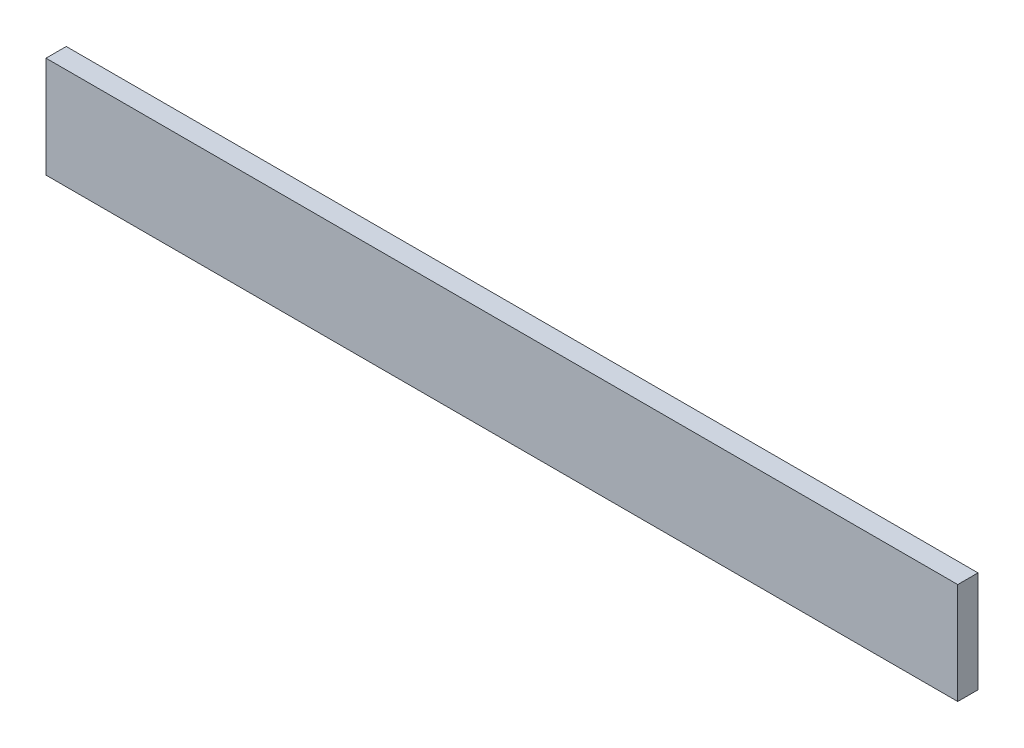
ISO-10303-21;
HEADER;
FILE_DESCRIPTION(('STEP AP214'),'2;1');
FILE_NAME('part.step','',(''),(''),'','','');
FILE_SCHEMA(('AUTOMOTIVE_DESIGN { 1 0 10303 214 1 1 1 1 }'));
ENDSEC;
DATA;
#1=APPLICATION_CONTEXT('core data for automotive mechanical design processes');
#2=APPLICATION_PROTOCOL_DEFINITION('international standard','automotive_design',2000,#1);
#3=PRODUCT_CONTEXT('',#1,'mechanical');
#4=PRODUCT('Part','Part','',(#3));
#5=PRODUCT_RELATED_PRODUCT_CATEGORY('part','',(#4));
#6=PRODUCT_DEFINITION_FORMATION('','',#4);
#7=PRODUCT_DEFINITION_CONTEXT('part definition',#1,'design');
#8=PRODUCT_DEFINITION('design','',#6,#7);
#9=PRODUCT_DEFINITION_SHAPE('','',#8);
#10=(LENGTH_UNIT() NAMED_UNIT(*) SI_UNIT(.MILLI.,.METRE.));
#11=(NAMED_UNIT(*) PLANE_ANGLE_UNIT() SI_UNIT($,.RADIAN.));
#12=(NAMED_UNIT(*) SI_UNIT($,.STERADIAN.) SOLID_ANGLE_UNIT());
#13=UNCERTAINTY_MEASURE_WITH_UNIT(LENGTH_MEASURE(1.E-05),#10,'distance_accuracy_value','');
#14=(GEOMETRIC_REPRESENTATION_CONTEXT(3) GLOBAL_UNCERTAINTY_ASSIGNED_CONTEXT((#13)) GLOBAL_UNIT_ASSIGNED_CONTEXT((#10,
#11,#12)) REPRESENTATION_CONTEXT('',''));
#15=CARTESIAN_POINT('',(0.,0.,0.));
#16=DIRECTION('',(0.,0.,1.));
#17=DIRECTION('',(1.,0.,0.));
#18=AXIS2_PLACEMENT_3D('',#15,#16,#17);
#19=CARTESIAN_POINT('',(450.,50.,20.));
#20=DIRECTION('',(-1.,0.,0.));
#21=DIRECTION('',(0.,0.,1.));
#22=AXIS2_PLACEMENT_3D('',#19,#20,#21);
#23=PLANE('',#22);
#24=DIRECTION('',(0.,1.,0.));
#25=VECTOR('',#24,1.);
#26=CARTESIAN_POINT('',(450.,50.,0.));
#27=LINE('',#26,#25);
#28=CARTESIAN_POINT('',(450.,-50.,0.));
#29=VERTEX_POINT('',#28);
#30=CARTESIAN_POINT('',(450.,50.,0.));
#31=VERTEX_POINT('',#30);
#32=EDGE_CURVE('E100',#29,#31,#27,.T.);
#33=ORIENTED_EDGE('',*,*,#32,.T.);
#34=DIRECTION('',(0.,0.,-1.));
#35=VECTOR('',#34,1.);
#36=CARTESIAN_POINT('',(450.,50.,20.));
#37=LINE('',#36,#35);
#38=CARTESIAN_POINT('',(450.,50.,20.));
#39=VERTEX_POINT('',#38);
#40=EDGE_CURVE('E91',#39,#31,#37,.T.);
#41=ORIENTED_EDGE('',*,*,#40,.F.);
#42=DIRECTION('',(0.,1.,0.));
#43=VECTOR('',#42,1.);
#44=CARTESIAN_POINT('',(450.,50.,20.));
#45=LINE('',#44,#43);
#46=CARTESIAN_POINT('',(450.,-50.,20.));
#47=VERTEX_POINT('',#46);
#48=EDGE_CURVE('E85',#47,#39,#45,.T.);
#49=ORIENTED_EDGE('',*,*,#48,.F.);
#50=DIRECTION('',(0.,0.,-1.));
#51=VECTOR('',#50,1.);
#52=CARTESIAN_POINT('',(450.,-50.,20.));
#53=LINE('',#52,#51);
#54=EDGE_CURVE('E96',#47,#29,#53,.T.);
#55=ORIENTED_EDGE('',*,*,#54,.T.);
#56=EDGE_LOOP('',(#33,#41,#49,#55));
#57=FACE_BOUND('',#56,.T.);
#58=ADVANCED_FACE('F33',(#57),#23,.F.);
#59=CARTESIAN_POINT('',(-450.,50.,20.));
#60=DIRECTION('',(0.,-1.,0.));
#61=DIRECTION('',(0.,0.,-1.));
#62=AXIS2_PLACEMENT_3D('',#59,#60,#61);
#63=PLANE('',#62);
#64=DIRECTION('',(-1.,0.,0.));
#65=VECTOR('',#64,1.);
#66=CARTESIAN_POINT('',(-450.,50.,0.));
#67=LINE('',#66,#65);
#68=CARTESIAN_POINT('',(-450.,50.,0.));
#69=VERTEX_POINT('',#68);
#70=EDGE_CURVE('E90',#31,#69,#67,.T.);
#71=ORIENTED_EDGE('',*,*,#70,.T.);
#72=DIRECTION('',(0.,0.,-1.));
#73=VECTOR('',#72,1.);
#74=CARTESIAN_POINT('',(-450.,50.,20.));
#75=LINE('',#74,#73);
#76=CARTESIAN_POINT('',(-450.,50.,20.));
#77=VERTEX_POINT('',#76);
#78=EDGE_CURVE('E88',#77,#69,#75,.T.);
#79=ORIENTED_EDGE('',*,*,#78,.F.);
#80=DIRECTION('',(-1.,0.,0.));
#81=VECTOR('',#80,1.);
#82=CARTESIAN_POINT('',(-450.,50.,20.));
#83=LINE('',#82,#81);
#84=EDGE_CURVE('E80',#39,#77,#83,.T.);
#85=ORIENTED_EDGE('',*,*,#84,.F.);
#86=ORIENTED_EDGE('',*,*,#40,.T.);
#87=EDGE_LOOP('',(#71,#79,#85,#86));
#88=FACE_BOUND('',#87,.T.);
#89=ADVANCED_FACE('F89',(#88),#63,.F.);
#90=CARTESIAN_POINT('',(-450.,50.,20.));
#91=DIRECTION('',(1.,0.,0.));
#92=DIRECTION('',(0.,0.,-1.));
#93=AXIS2_PLACEMENT_3D('',#90,#91,#92);
#94=PLANE('',#93);
#95=DIRECTION('',(0.,-1.,0.));
#96=VECTOR('',#95,1.);
#97=CARTESIAN_POINT('',(-450.,50.,0.));
#98=LINE('',#97,#96);
#99=CARTESIAN_POINT('',(-450.,-50.,0.));
#100=VERTEX_POINT('',#99);
#101=EDGE_CURVE('E66',#69,#100,#98,.T.);
#102=ORIENTED_EDGE('',*,*,#101,.T.);
#103=DIRECTION('',(0.,0.,-1.));
#104=VECTOR('',#103,1.);
#105=CARTESIAN_POINT('',(-450.,-50.,20.));
#106=LINE('',#105,#104);
#107=CARTESIAN_POINT('',(-450.,-50.,20.));
#108=VERTEX_POINT('',#107);
#109=EDGE_CURVE('E92',#108,#100,#106,.T.);
#110=ORIENTED_EDGE('',*,*,#109,.F.);
#111=DIRECTION('',(0.,-1.,0.));
#112=VECTOR('',#111,1.);
#113=CARTESIAN_POINT('',(-450.,50.,20.));
#114=LINE('',#113,#112);
#115=EDGE_CURVE('E83',#77,#108,#114,.T.);
#116=ORIENTED_EDGE('',*,*,#115,.F.);
#117=ORIENTED_EDGE('',*,*,#78,.T.);
#118=EDGE_LOOP('',(#102,#110,#116,#117));
#119=FACE_BOUND('',#118,.T.);
#120=ADVANCED_FACE('F94',(#119),#94,.F.);
#121=CARTESIAN_POINT('',(-450.,-50.,20.));
#122=DIRECTION('',(0.,1.,0.));
#123=DIRECTION('',(0.,0.,1.));
#124=AXIS2_PLACEMENT_3D('',#121,#122,#123);
#125=PLANE('',#124);
#126=DIRECTION('',(1.,0.,0.));
#127=VECTOR('',#126,1.);
#128=CARTESIAN_POINT('',(-450.,-50.,0.));
#129=LINE('',#128,#127);
#130=EDGE_CURVE('E72',#100,#29,#129,.T.);
#131=ORIENTED_EDGE('',*,*,#130,.T.);
#132=ORIENTED_EDGE('',*,*,#54,.F.);
#133=DIRECTION('',(1.,0.,0.));
#134=VECTOR('',#133,1.);
#135=CARTESIAN_POINT('',(-450.,-50.,20.));
#136=LINE('',#135,#134);
#137=EDGE_CURVE('E49',#108,#47,#136,.T.);
#138=ORIENTED_EDGE('',*,*,#137,.F.);
#139=ORIENTED_EDGE('',*,*,#109,.T.);
#140=EDGE_LOOP('',(#131,#132,#138,#139));
#141=FACE_BOUND('',#140,.T.);
#142=ADVANCED_FACE('F160',(#141),#125,.F.);
#143=CARTESIAN_POINT('',(0.,0.,20.));
#144=DIRECTION('',(0.,0.,1.));
#145=DIRECTION('',(1.,0.,0.));
#146=AXIS2_PLACEMENT_3D('',#143,#144,#145);
#147=PLANE('',#146);
#148=ORIENTED_EDGE('',*,*,#48,.T.);
#149=ORIENTED_EDGE('',*,*,#84,.T.);
#150=ORIENTED_EDGE('',*,*,#115,.T.);
#151=ORIENTED_EDGE('',*,*,#137,.T.);
#152=EDGE_LOOP('',(#148,#149,#150,#151));
#153=FACE_BOUND('',#152,.T.);
#154=ADVANCED_FACE('F81',(#153),#147,.T.);
#155=CARTESIAN_POINT('',(0.,0.,0.));
#156=DIRECTION('',(0.,0.,1.));
#157=DIRECTION('',(1.,0.,0.));
#158=AXIS2_PLACEMENT_3D('',#155,#156,#157);
#159=PLANE('',#158);
#160=CARTESIAN_POINT('',(300.,-30.95,0.));
#161=DIRECTION('',(0.,0.,1.));
#162=DIRECTION('',(1.,0.,0.));
#163=AXIS2_PLACEMENT_3D('',#160,#161,#162);
#164=CIRCLE('',#163,9.7);
#165=CARTESIAN_POINT('',(309.7,-30.95,0.));
#166=VERTEX_POINT('',#165);
#167=EDGE_CURVE('E164',#166,#166,#164,.T.);
#168=ORIENTED_EDGE('',*,*,#167,.T.);
#169=EDGE_LOOP('',(#168));
#170=FACE_BOUND('',#169,.T.);
#171=CARTESIAN_POINT('',(0.,-30.95,0.));
#172=DIRECTION('',(0.,0.,1.));
#173=DIRECTION('',(1.,0.,0.));
#174=AXIS2_PLACEMENT_3D('',#171,#172,#173);
#175=CIRCLE('',#174,9.7);
#176=CARTESIAN_POINT('',(9.7,-30.95,0.));
#177=VERTEX_POINT('',#176);
#178=EDGE_CURVE('E168',#177,#177,#175,.T.);
#179=ORIENTED_EDGE('',*,*,#178,.T.);
#180=EDGE_LOOP('',(#179));
#181=FACE_BOUND('',#180,.T.);
#182=CARTESIAN_POINT('',(-300.,-30.95,0.));
#183=DIRECTION('',(0.,0.,1.));
#184=DIRECTION('',(1.,0.,0.));
#185=AXIS2_PLACEMENT_3D('',#182,#183,#184);
#186=CIRCLE('',#185,9.7);
#187=CARTESIAN_POINT('',(-290.3,-30.95,0.));
#188=VERTEX_POINT('',#187);
#189=EDGE_CURVE('E171',#188,#188,#186,.T.);
#190=ORIENTED_EDGE('',*,*,#189,.T.);
#191=EDGE_LOOP('',(#190));
#192=FACE_BOUND('',#191,.T.);
#193=ORIENTED_EDGE('',*,*,#32,.F.);
#194=ORIENTED_EDGE('',*,*,#130,.F.);
#195=ORIENTED_EDGE('',*,*,#101,.F.);
#196=ORIENTED_EDGE('',*,*,#70,.F.);
#197=EDGE_LOOP('',(#193,#194,#195,#196));
#198=FACE_BOUND('',#197,.T.);
#199=ADVANCED_FACE('F133',(#170,#181,#192,#198),#159,.F.);
#200=CARTESIAN_POINT('',(-300.,-30.95,-15.8));
#201=DIRECTION('',(0.,0.,1.));
#202=DIRECTION('',(1.,0.,0.));
#203=AXIS2_PLACEMENT_3D('',#200,#201,#202);
#204=CYLINDRICAL_SURFACE('',#203,9.7);
#205=CARTESIAN_POINT('',(-300.,-30.95,-15.8));
#206=DIRECTION('',(0.,0.,1.));
#207=DIRECTION('',(1.,0.,0.));
#208=AXIS2_PLACEMENT_3D('',#205,#206,#207);
#209=CIRCLE('',#208,9.7);
#210=CARTESIAN_POINT('',(-290.3,-30.95,-15.8));
#211=VERTEX_POINT('',#210);
#212=EDGE_CURVE('E103',#211,#211,#209,.T.);
#213=ORIENTED_EDGE('',*,*,#212,.T.);
#214=EDGE_LOOP('',(#213));
#215=FACE_BOUND('',#214,.T.);
#216=ORIENTED_EDGE('',*,*,#189,.F.);
#217=EDGE_LOOP('',(#216));
#218=FACE_BOUND('',#217,.T.);
#219=ADVANCED_FACE('F151',(#215,#218),#204,.T.);
#220=CARTESIAN_POINT('',(-300.,-30.95,-15.8));
#221=DIRECTION('',(0.,0.,1.));
#222=DIRECTION('',(1.,0.,0.));
#223=AXIS2_PLACEMENT_3D('',#220,#221,#222);
#224=PLANE('',#223);
#225=CARTESIAN_POINT('',(-300.,-30.95,-15.8));
#226=DIRECTION('',(0.,0.,1.));
#227=DIRECTION('',(1.,0.,0.));
#228=AXIS2_PLACEMENT_3D('',#225,#226,#227);
#229=CIRCLE('',#228,4.82599999999999);
#230=CARTESIAN_POINT('',(-295.174,-30.95,-15.8));
#231=VERTEX_POINT('',#230);
#232=EDGE_CURVE('E173',#231,#231,#229,.T.);
#233=ORIENTED_EDGE('',*,*,#232,.T.);
#234=EDGE_LOOP('',(#233));
#235=FACE_BOUND('',#234,.T.);
#236=ORIENTED_EDGE('',*,*,#212,.F.);
#237=EDGE_LOOP('',(#236));
#238=FACE_BOUND('',#237,.T.);
#239=ADVANCED_FACE('F157',(#235,#238),#224,.F.);
#240=CARTESIAN_POINT('',(-300.,-30.95,-15.8));
#241=DIRECTION('',(0.,0.,1.));
#242=DIRECTION('',(1.,0.,0.));
#243=AXIS2_PLACEMENT_3D('',#240,#241,#242);
#244=CYLINDRICAL_SURFACE('',#243,4.82599999999999);
#245=ORIENTED_EDGE('',*,*,#232,.F.);
#246=EDGE_LOOP('',(#245));
#247=FACE_BOUND('',#246,.T.);
#248=CARTESIAN_POINT('',(-300.,-30.95,0.));
#249=DIRECTION('',(0.,0.,1.));
#250=DIRECTION('',(1.,0.,0.));
#251=AXIS2_PLACEMENT_3D('',#248,#249,#250);
#252=CIRCLE('',#251,4.82599999999999);
#253=CARTESIAN_POINT('',(-295.174,-30.95,0.));
#254=VERTEX_POINT('',#253);
#255=EDGE_CURVE('E110',#254,#254,#252,.T.);
#256=ORIENTED_EDGE('',*,*,#255,.T.);
#257=EDGE_LOOP('',(#256));
#258=FACE_BOUND('',#257,.T.);
#259=ADVANCED_FACE('F138',(#247,#258),#244,.F.);
#260=ORIENTED_EDGE('',*,*,#255,.F.);
#261=EDGE_LOOP('',(#260));
#262=FACE_BOUND('',#261,.T.);
#263=ADVANCED_FACE('F121',(#262),#159,.F.);
#264=CARTESIAN_POINT('',(0.,-30.95,-15.8));
#265=DIRECTION('',(0.,0.,1.));
#266=DIRECTION('',(1.,0.,0.));
#267=AXIS2_PLACEMENT_3D('',#264,#265,#266);
#268=CYLINDRICAL_SURFACE('',#267,9.7);
#269=CARTESIAN_POINT('',(0.,-30.95,-15.8));
#270=DIRECTION('',(0.,0.,1.));
#271=DIRECTION('',(1.,0.,0.));
#272=AXIS2_PLACEMENT_3D('',#269,#270,#271);
#273=CIRCLE('',#272,9.7);
#274=CARTESIAN_POINT('',(9.7,-30.95,-15.8));
#275=VERTEX_POINT('',#274);
#276=EDGE_CURVE('E178',#275,#275,#273,.T.);
#277=ORIENTED_EDGE('',*,*,#276,.T.);
#278=EDGE_LOOP('',(#277));
#279=FACE_BOUND('',#278,.T.);
#280=ORIENTED_EDGE('',*,*,#178,.F.);
#281=EDGE_LOOP('',(#280));
#282=FACE_BOUND('',#281,.T.);
#283=ADVANCED_FACE('F137',(#279,#282),#268,.T.);
#284=CARTESIAN_POINT('',(0.,-30.95,-15.8));
#285=DIRECTION('',(0.,0.,1.));
#286=DIRECTION('',(1.,0.,0.));
#287=AXIS2_PLACEMENT_3D('',#284,#285,#286);
#288=PLANE('',#287);
#289=CARTESIAN_POINT('',(0.,-30.95,-15.8));
#290=DIRECTION('',(0.,0.,1.));
#291=DIRECTION('',(1.,0.,0.));
#292=AXIS2_PLACEMENT_3D('',#289,#290,#291);
#293=CIRCLE('',#292,4.826);
#294=CARTESIAN_POINT('',(4.826,-30.95,-15.8));
#295=VERTEX_POINT('',#294);
#296=EDGE_CURVE('E182',#295,#295,#293,.T.);
#297=ORIENTED_EDGE('',*,*,#296,.T.);
#298=EDGE_LOOP('',(#297));
#299=FACE_BOUND('',#298,.T.);
#300=ORIENTED_EDGE('',*,*,#276,.F.);
#301=EDGE_LOOP('',(#300));
#302=FACE_BOUND('',#301,.T.);
#303=ADVANCED_FACE('F130',(#299,#302),#288,.F.);
#304=CARTESIAN_POINT('',(0.,-30.95,-15.8));
#305=DIRECTION('',(0.,0.,1.));
#306=DIRECTION('',(1.,0.,0.));
#307=AXIS2_PLACEMENT_3D('',#304,#305,#306);
#308=CYLINDRICAL_SURFACE('',#307,4.826);
#309=ORIENTED_EDGE('',*,*,#296,.F.);
#310=EDGE_LOOP('',(#309));
#311=FACE_BOUND('',#310,.T.);
#312=CARTESIAN_POINT('',(0.,-30.95,0.));
#313=DIRECTION('',(0.,0.,1.));
#314=DIRECTION('',(1.,0.,0.));
#315=AXIS2_PLACEMENT_3D('',#312,#313,#314);
#316=CIRCLE('',#315,4.826);
#317=CARTESIAN_POINT('',(4.826,-30.95,0.));
#318=VERTEX_POINT('',#317);
#319=EDGE_CURVE('E41',#318,#318,#316,.T.);
#320=ORIENTED_EDGE('',*,*,#319,.T.);
#321=EDGE_LOOP('',(#320));
#322=FACE_BOUND('',#321,.T.);
#323=ADVANCED_FACE('F115',(#311,#322),#308,.F.);
#324=ORIENTED_EDGE('',*,*,#319,.F.);
#325=EDGE_LOOP('',(#324));
#326=FACE_BOUND('',#325,.T.);
#327=ADVANCED_FACE('F117',(#326),#159,.F.);
#328=CARTESIAN_POINT('',(300.,-30.95,-15.8));
#329=DIRECTION('',(0.,0.,1.));
#330=DIRECTION('',(1.,0.,0.));
#331=AXIS2_PLACEMENT_3D('',#328,#329,#330);
#332=CYLINDRICAL_SURFACE('',#331,9.7);
#333=CARTESIAN_POINT('',(300.,-30.95,-15.8));
#334=DIRECTION('',(0.,0.,1.));
#335=DIRECTION('',(1.,0.,0.));
#336=AXIS2_PLACEMENT_3D('',#333,#334,#335);
#337=CIRCLE('',#336,9.7);
#338=CARTESIAN_POINT('',(309.7,-30.95,-15.8));
#339=VERTEX_POINT('',#338);
#340=EDGE_CURVE('E187',#339,#339,#337,.T.);
#341=ORIENTED_EDGE('',*,*,#340,.T.);
#342=EDGE_LOOP('',(#341));
#343=FACE_BOUND('',#342,.T.);
#344=ORIENTED_EDGE('',*,*,#167,.F.);
#345=EDGE_LOOP('',(#344));
#346=FACE_BOUND('',#345,.T.);
#347=ADVANCED_FACE('F119',(#343,#346),#332,.T.);
#348=CARTESIAN_POINT('',(300.,-30.95,-15.8));
#349=DIRECTION('',(0.,0.,1.));
#350=DIRECTION('',(1.,0.,0.));
#351=AXIS2_PLACEMENT_3D('',#348,#349,#350);
#352=PLANE('',#351);
#353=CARTESIAN_POINT('',(300.,-30.95,-15.8));
#354=DIRECTION('',(0.,0.,1.));
#355=DIRECTION('',(1.,0.,0.));
#356=AXIS2_PLACEMENT_3D('',#353,#354,#355);
#357=CIRCLE('',#356,4.82599999999999);
#358=CARTESIAN_POINT('',(304.826,-30.95,-15.8));
#359=VERTEX_POINT('',#358);
#360=EDGE_CURVE('E189',#359,#359,#357,.T.);
#361=ORIENTED_EDGE('',*,*,#360,.T.);
#362=EDGE_LOOP('',(#361));
#363=FACE_BOUND('',#362,.T.);
#364=ORIENTED_EDGE('',*,*,#340,.F.);
#365=EDGE_LOOP('',(#364));
#366=FACE_BOUND('',#365,.T.);
#367=ADVANCED_FACE('F127',(#363,#366),#352,.F.);
#368=CARTESIAN_POINT('',(300.,-30.95,-15.8));
#369=DIRECTION('',(0.,0.,1.));
#370=DIRECTION('',(1.,0.,0.));
#371=AXIS2_PLACEMENT_3D('',#368,#369,#370);
#372=CYLINDRICAL_SURFACE('',#371,4.82599999999999);
#373=ORIENTED_EDGE('',*,*,#360,.F.);
#374=EDGE_LOOP('',(#373));
#375=FACE_BOUND('',#374,.T.);
#376=CARTESIAN_POINT('',(300.,-30.95,0.));
#377=DIRECTION('',(0.,0.,1.));
#378=DIRECTION('',(1.,0.,0.));
#379=AXIS2_PLACEMENT_3D('',#376,#377,#378);
#380=CIRCLE('',#379,4.82599999999999);
#381=CARTESIAN_POINT('',(304.826,-30.95,0.));
#382=VERTEX_POINT('',#381);
#383=EDGE_CURVE('E11',#382,#382,#380,.T.);
#384=ORIENTED_EDGE('',*,*,#383,.T.);
#385=EDGE_LOOP('',(#384));
#386=FACE_BOUND('',#385,.T.);
#387=ADVANCED_FACE('F141',(#375,#386),#372,.F.);
#388=ORIENTED_EDGE('',*,*,#383,.F.);
#389=EDGE_LOOP('',(#388));
#390=FACE_BOUND('',#389,.T.);
#391=ADVANCED_FACE('F122',(#390),#159,.F.);
#392=CLOSED_SHELL('',(#58,#89,#120,#142,#154,#199,#219,#239,#259,#263,#283,#303,#323,#327,#347,
#367,#387,#391));
#393=MANIFOLD_SOLID_BREP('B2',#392);
#394=ADVANCED_BREP_SHAPE_REPRESENTATION('',(#18,#393),#14);
#395=SHAPE_DEFINITION_REPRESENTATION(#9,#394);
ENDSEC;
END-ISO-10303-21;
